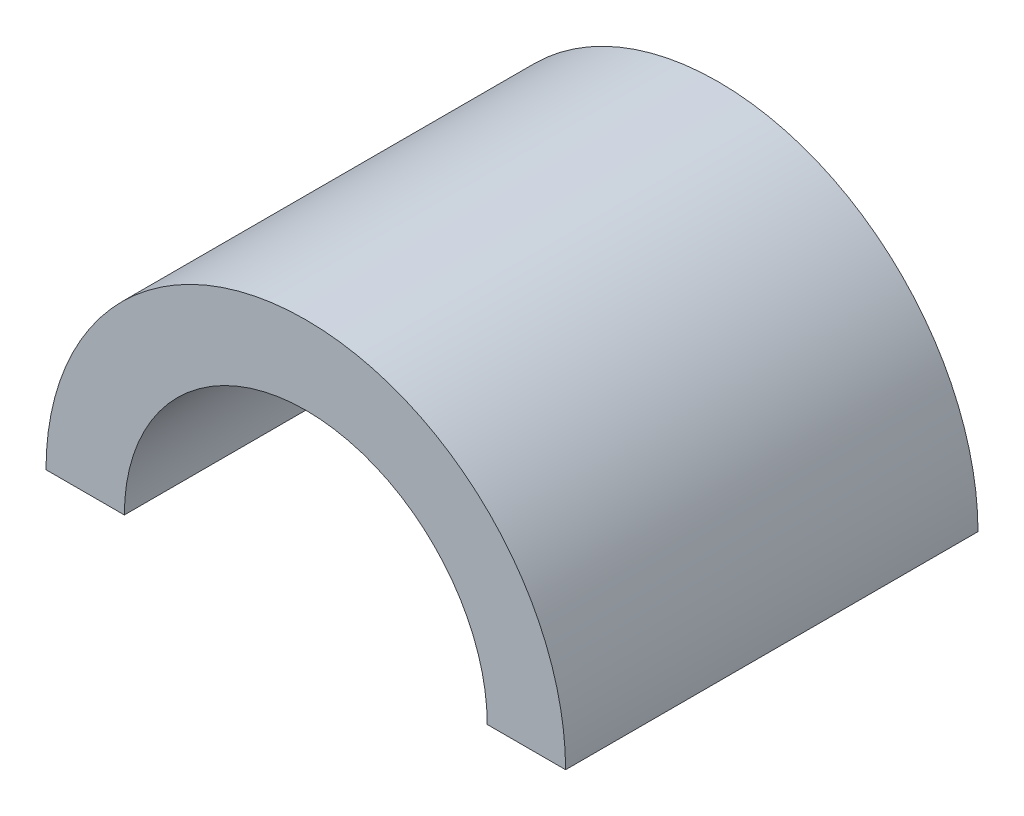
ISO-10303-21;
HEADER;
FILE_DESCRIPTION(('STEP AP214'),'2;1');
FILE_NAME('part.step','',(''),(''),'','','');
FILE_SCHEMA(('AUTOMOTIVE_DESIGN { 1 0 10303 214 1 1 1 1 }'));
ENDSEC;
DATA;
#1=APPLICATION_CONTEXT('core data for automotive mechanical design processes');
#2=APPLICATION_PROTOCOL_DEFINITION('international standard','automotive_design',2000,#1);
#3=PRODUCT_CONTEXT('',#1,'mechanical');
#4=PRODUCT('Part','Part','',(#3));
#5=PRODUCT_RELATED_PRODUCT_CATEGORY('part','',(#4));
#6=PRODUCT_DEFINITION_FORMATION('','',#4);
#7=PRODUCT_DEFINITION_CONTEXT('part definition',#1,'design');
#8=PRODUCT_DEFINITION('design','',#6,#7);
#9=PRODUCT_DEFINITION_SHAPE('','',#8);
#10=(LENGTH_UNIT() NAMED_UNIT(*) SI_UNIT(.MILLI.,.METRE.));
#11=(NAMED_UNIT(*) PLANE_ANGLE_UNIT() SI_UNIT($,.RADIAN.));
#12=(NAMED_UNIT(*) SI_UNIT($,.STERADIAN.) SOLID_ANGLE_UNIT());
#13=UNCERTAINTY_MEASURE_WITH_UNIT(LENGTH_MEASURE(1.E-05),#10,'distance_accuracy_value','');
#14=(GEOMETRIC_REPRESENTATION_CONTEXT(3) GLOBAL_UNCERTAINTY_ASSIGNED_CONTEXT((#13)) GLOBAL_UNIT_ASSIGNED_CONTEXT((#10,
#11,#12)) REPRESENTATION_CONTEXT('',''));
#15=CARTESIAN_POINT('',(0.,0.,0.));
#16=DIRECTION('',(0.,0.,1.));
#17=DIRECTION('',(1.,0.,0.));
#18=AXIS2_PLACEMENT_3D('',#15,#16,#17);
#19=CARTESIAN_POINT('',(0.,0.,25.4));
#20=DIRECTION('',(0.,0.,-1.));
#21=DIRECTION('',(-1.,0.,0.));
#22=AXIS2_PLACEMENT_3D('',#19,#20,#21);
#23=CYLINDRICAL_SURFACE('',#22,16.002);
#24=CARTESIAN_POINT('',(0.,0.,0.));
#25=DIRECTION('',(0.,0.,1.));
#26=DIRECTION('',(1.,0.,0.));
#27=AXIS2_PLACEMENT_3D('',#24,#25,#26);
#28=CIRCLE('',#27,16.002);
#29=CARTESIAN_POINT('',(16.002,0.,0.));
#30=VERTEX_POINT('',#29);
#31=CARTESIAN_POINT('',(-16.002,0.,0.));
#32=VERTEX_POINT('',#31);
#33=EDGE_CURVE('E97',#30,#32,#28,.T.);
#34=ORIENTED_EDGE('',*,*,#33,.T.);
#35=DIRECTION('',(0.,0.,-1.));
#36=VECTOR('',#35,1.);
#37=CARTESIAN_POINT('',(-16.002,0.,25.4));
#38=LINE('',#37,#36);
#39=CARTESIAN_POINT('',(-16.002,0.,25.4));
#40=VERTEX_POINT('',#39);
#41=EDGE_CURVE('E11',#40,#32,#38,.T.);
#42=ORIENTED_EDGE('',*,*,#41,.F.);
#43=CARTESIAN_POINT('',(0.,0.,25.4));
#44=DIRECTION('',(0.,0.,1.));
#45=DIRECTION('',(1.,0.,0.));
#46=AXIS2_PLACEMENT_3D('',#43,#44,#45);
#47=CIRCLE('',#46,16.002);
#48=CARTESIAN_POINT('',(16.002,0.,25.4));
#49=VERTEX_POINT('',#48);
#50=EDGE_CURVE('E85',#49,#40,#47,.T.);
#51=ORIENTED_EDGE('',*,*,#50,.F.);
#52=DIRECTION('',(0.,0.,-1.));
#53=VECTOR('',#52,1.);
#54=CARTESIAN_POINT('',(16.002,0.,25.4));
#55=LINE('',#54,#53);
#56=EDGE_CURVE('E93',#49,#30,#55,.T.);
#57=ORIENTED_EDGE('',*,*,#56,.T.);
#58=EDGE_LOOP('',(#34,#42,#51,#57));
#59=FACE_BOUND('',#58,.T.);
#60=ADVANCED_FACE('F34',(#59),#23,.T.);
#61=CARTESIAN_POINT('',(-16.002,0.,25.4));
#62=DIRECTION('',(0.,1.,0.));
#63=DIRECTION('',(0.,0.,1.));
#64=AXIS2_PLACEMENT_3D('',#61,#62,#63);
#65=PLANE('',#64);
#66=DIRECTION('',(1.,0.,0.));
#67=VECTOR('',#66,1.);
#68=CARTESIAN_POINT('',(-16.002,0.,0.));
#69=LINE('',#68,#67);
#70=CARTESIAN_POINT('',(-11.176,0.,0.));
#71=VERTEX_POINT('',#70);
#72=EDGE_CURVE('E89',#32,#71,#69,.T.);
#73=ORIENTED_EDGE('',*,*,#72,.T.);
#74=DIRECTION('',(0.,0.,-1.));
#75=VECTOR('',#74,1.);
#76=CARTESIAN_POINT('',(-11.176,0.,25.4));
#77=LINE('',#76,#75);
#78=CARTESIAN_POINT('',(-11.176,0.,25.4));
#79=VERTEX_POINT('',#78);
#80=EDGE_CURVE('E42',#79,#71,#77,.T.);
#81=ORIENTED_EDGE('',*,*,#80,.F.);
#82=DIRECTION('',(1.,0.,0.));
#83=VECTOR('',#82,1.);
#84=CARTESIAN_POINT('',(-16.002,0.,25.4));
#85=LINE('',#84,#83);
#86=EDGE_CURVE('E80',#40,#79,#85,.T.);
#87=ORIENTED_EDGE('',*,*,#86,.F.);
#88=ORIENTED_EDGE('',*,*,#41,.T.);
#89=EDGE_LOOP('',(#73,#81,#87,#88));
#90=FACE_BOUND('',#89,.T.);
#91=ADVANCED_FACE('F88',(#90),#65,.F.);
#92=CARTESIAN_POINT('',(0.,0.,25.4));
#93=DIRECTION('',(0.,0.,-1.));
#94=DIRECTION('',(-1.,0.,0.));
#95=AXIS2_PLACEMENT_3D('',#92,#93,#94);
#96=CYLINDRICAL_SURFACE('',#95,11.176);
#97=CARTESIAN_POINT('',(0.,0.,0.));
#98=DIRECTION('',(0.,0.,-1.));
#99=DIRECTION('',(1.,0.,0.));
#100=AXIS2_PLACEMENT_3D('',#97,#98,#99);
#101=CIRCLE('',#100,11.176);
#102=CARTESIAN_POINT('',(11.176,0.,0.));
#103=VERTEX_POINT('',#102);
#104=EDGE_CURVE('E67',#71,#103,#101,.T.);
#105=ORIENTED_EDGE('',*,*,#104,.T.);
#106=DIRECTION('',(0.,0.,-1.));
#107=VECTOR('',#106,1.);
#108=CARTESIAN_POINT('',(11.176,0.,25.4));
#109=LINE('',#108,#107);
#110=CARTESIAN_POINT('',(11.176,0.,25.4));
#111=VERTEX_POINT('',#110);
#112=EDGE_CURVE('E90',#111,#103,#109,.T.);
#113=ORIENTED_EDGE('',*,*,#112,.F.);
#114=CARTESIAN_POINT('',(0.,0.,25.4));
#115=DIRECTION('',(0.,0.,-1.));
#116=DIRECTION('',(1.,0.,0.));
#117=AXIS2_PLACEMENT_3D('',#114,#115,#116);
#118=CIRCLE('',#117,11.176);
#119=EDGE_CURVE('E83',#79,#111,#118,.T.);
#120=ORIENTED_EDGE('',*,*,#119,.F.);
#121=ORIENTED_EDGE('',*,*,#80,.T.);
#122=EDGE_LOOP('',(#105,#113,#120,#121));
#123=FACE_BOUND('',#122,.T.);
#124=ADVANCED_FACE('F91',(#123),#96,.F.);
#125=CARTESIAN_POINT('',(11.176,0.,25.4));
#126=DIRECTION('',(0.,1.,0.));
#127=DIRECTION('',(0.,0.,1.));
#128=AXIS2_PLACEMENT_3D('',#125,#126,#127);
#129=PLANE('',#128);
#130=DIRECTION('',(1.,0.,0.));
#131=VECTOR('',#130,1.);
#132=CARTESIAN_POINT('',(11.176,0.,0.));
#133=LINE('',#132,#131);
#134=EDGE_CURVE('E73',#103,#30,#133,.T.);
#135=ORIENTED_EDGE('',*,*,#134,.T.);
#136=ORIENTED_EDGE('',*,*,#56,.F.);
#137=DIRECTION('',(1.,0.,0.));
#138=VECTOR('',#137,1.);
#139=CARTESIAN_POINT('',(11.176,0.,25.4));
#140=LINE('',#139,#138);
#141=EDGE_CURVE('E50',#111,#49,#140,.T.);
#142=ORIENTED_EDGE('',*,*,#141,.F.);
#143=ORIENTED_EDGE('',*,*,#112,.T.);
#144=EDGE_LOOP('',(#135,#136,#142,#143));
#145=FACE_BOUND('',#144,.T.);
#146=ADVANCED_FACE('F104',(#145),#129,.F.);
#147=CARTESIAN_POINT('',(0.,0.,25.4));
#148=DIRECTION('',(0.,0.,1.));
#149=DIRECTION('',(1.,0.,0.));
#150=AXIS2_PLACEMENT_3D('',#147,#148,#149);
#151=PLANE('',#150);
#152=ORIENTED_EDGE('',*,*,#50,.T.);
#153=ORIENTED_EDGE('',*,*,#86,.T.);
#154=ORIENTED_EDGE('',*,*,#119,.T.);
#155=ORIENTED_EDGE('',*,*,#141,.T.);
#156=EDGE_LOOP('',(#152,#153,#154,#155));
#157=FACE_BOUND('',#156,.T.);
#158=ADVANCED_FACE('F81',(#157),#151,.T.);
#159=CARTESIAN_POINT('',(0.,0.,0.));
#160=DIRECTION('',(0.,0.,1.));
#161=DIRECTION('',(1.,0.,0.));
#162=AXIS2_PLACEMENT_3D('',#159,#160,#161);
#163=PLANE('',#162);
#164=ORIENTED_EDGE('',*,*,#33,.F.);
#165=ORIENTED_EDGE('',*,*,#134,.F.);
#166=ORIENTED_EDGE('',*,*,#104,.F.);
#167=ORIENTED_EDGE('',*,*,#72,.F.);
#168=EDGE_LOOP('',(#164,#165,#166,#167));
#169=FACE_BOUND('',#168,.T.);
#170=ADVANCED_FACE('F107',(#169),#163,.F.);
#171=CLOSED_SHELL('',(#60,#91,#124,#146,#158,#170));
#172=MANIFOLD_SOLID_BREP('B2',#171);
#173=ADVANCED_BREP_SHAPE_REPRESENTATION('',(#18,#172),#14);
#174=SHAPE_DEFINITION_REPRESENTATION(#9,#173);
ENDSEC;
END-ISO-10303-21;
